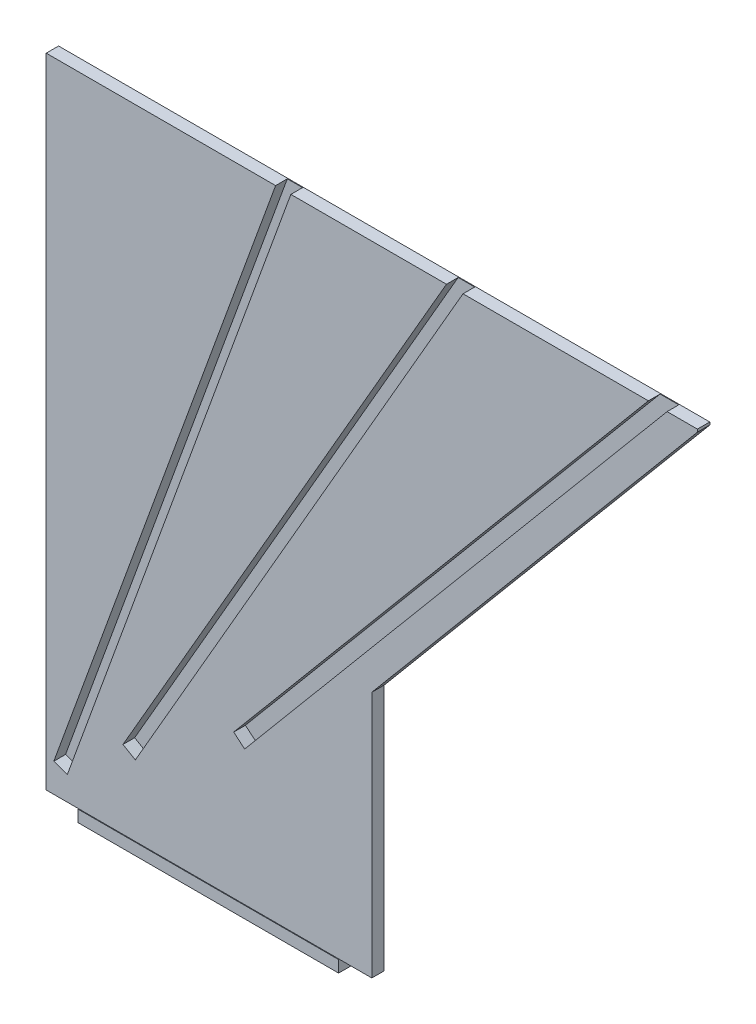
ISO-10303-21;
HEADER;
FILE_DESCRIPTION(('STEP AP214'),'2;1');
FILE_NAME('part.step','',(''),(''),'','','');
FILE_SCHEMA(('AUTOMOTIVE_DESIGN { 1 0 10303 214 1 1 1 1 }'));
ENDSEC;
DATA;
#1=APPLICATION_CONTEXT('core data for automotive mechanical design processes');
#2=APPLICATION_PROTOCOL_DEFINITION('international standard','automotive_design',2000,#1);
#3=PRODUCT_CONTEXT('',#1,'mechanical');
#4=PRODUCT('Part','Part','',(#3));
#5=PRODUCT_RELATED_PRODUCT_CATEGORY('part','',(#4));
#6=PRODUCT_DEFINITION_FORMATION('','',#4);
#7=PRODUCT_DEFINITION_CONTEXT('part definition',#1,'design');
#8=PRODUCT_DEFINITION('design','',#6,#7);
#9=PRODUCT_DEFINITION_SHAPE('','',#8);
#10=(LENGTH_UNIT() NAMED_UNIT(*) SI_UNIT(.MILLI.,.METRE.));
#11=(NAMED_UNIT(*) PLANE_ANGLE_UNIT() SI_UNIT($,.RADIAN.));
#12=(NAMED_UNIT(*) SI_UNIT($,.STERADIAN.) SOLID_ANGLE_UNIT());
#13=UNCERTAINTY_MEASURE_WITH_UNIT(LENGTH_MEASURE(1.E-05),#10,'distance_accuracy_value','');
#14=(GEOMETRIC_REPRESENTATION_CONTEXT(3) GLOBAL_UNCERTAINTY_ASSIGNED_CONTEXT((#13)) GLOBAL_UNIT_ASSIGNED_CONTEXT((#10,
#11,#12)) REPRESENTATION_CONTEXT('',''));
#15=CARTESIAN_POINT('',(0.,0.,0.));
#16=DIRECTION('',(0.,0.,1.));
#17=DIRECTION('',(1.,0.,0.));
#18=AXIS2_PLACEMENT_3D('',#15,#16,#17);
#19=CARTESIAN_POINT('',(-27.0477589529464,9.84457916247911,1.9));
#20=DIRECTION('',(0.939692620785914,-0.342020143325652,0.));
#21=DIRECTION('',(0.342020143325652,0.939692620785915,0.));
#22=AXIS2_PLACEMENT_3D('',#19,#20,#21);
#23=PLANE('',#22);
#24=DIRECTION('',(-0.342020143325652,-0.939692620785914,0.));
#25=VECTOR('',#24,1.);
#26=CARTESIAN_POINT('',(-46.771329023081,-44.3454842362497,0.1));
#27=LINE('',#26,#25);
#28=CARTESIAN_POINT('',(-12.4323810236568,50.,0.1));
#29=VERTEX_POINT('',#28);
#30=CARTESIAN_POINT('',(-46.771329023081,-44.3454842362497,0.1));
#31=VERTEX_POINT('',#30);
#32=EDGE_CURVE('E229',#29,#31,#27,.T.);
#33=ORIENTED_EDGE('',*,*,#32,.T.);
#34=DIRECTION('',(0.,0.,-1.));
#35=VECTOR('',#34,1.);
#36=CARTESIAN_POINT('',(-46.771329023081,-44.3454842362497,1.9));
#37=LINE('',#36,#35);
#38=CARTESIAN_POINT('',(-46.771329023081,-44.3454842362497,1.9));
#39=VERTEX_POINT('',#38);
#40=EDGE_CURVE('E389',#39,#31,#37,.T.);
#41=ORIENTED_EDGE('',*,*,#40,.F.);
#42=DIRECTION('',(-0.342020143325652,-0.939692620785915,0.));
#43=VECTOR('',#42,1.);
#44=CARTESIAN_POINT('',(-27.0477589529464,9.84457916247911,1.9));
#45=LINE('',#44,#43);
#46=CARTESIAN_POINT('',(-12.4323810236568,50.,1.9));
#47=VERTEX_POINT('',#46);
#48=EDGE_CURVE('E334',#47,#39,#45,.T.);
#49=ORIENTED_EDGE('',*,*,#48,.F.);
#50=DIRECTION('',(0.,0.,-1.));
#51=VECTOR('',#50,1.);
#52=CARTESIAN_POINT('',(-12.4323810236568,50.,1.9));
#53=LINE('',#52,#51);
#54=EDGE_CURVE('E393',#47,#29,#53,.T.);
#55=ORIENTED_EDGE('',*,*,#54,.T.);
#56=EDGE_LOOP('',(#33,#41,#49,#55));
#57=FACE_BOUND('',#56,.T.);
#58=ADVANCED_FACE('F43',(#57),#23,.F.);
#59=CARTESIAN_POINT('',(-19.7235700701345,-54.1900633987288,1.9));
#60=DIRECTION('',(0.342020143325651,0.939692620785915,0.));
#61=DIRECTION('',(-0.939692620785915,0.342020143325651,0.));
#62=AXIS2_PLACEMENT_3D('',#59,#60,#61);
#63=PLANE('',#62);
#64=ORIENTED_EDGE('',*,*,#40,.T.);
#65=DIRECTION('',(-0.939692620785913,0.342020143325656,0.));
#66=VECTOR('',#65,1.);
#67=CARTESIAN_POINT('',(-48.8386527888107,-43.5930399209329,0.1));
#68=LINE('',#67,#66);
#69=CARTESIAN_POINT('',(-48.8386527888107,-43.5930399209329,0.1));
#70=VERTEX_POINT('',#69);
#71=EDGE_CURVE('E247',#31,#70,#68,.T.);
#72=ORIENTED_EDGE('',*,*,#71,.T.);
#73=DIRECTION('',(0.,0.,-1.));
#74=VECTOR('',#73,1.);
#75=CARTESIAN_POINT('',(-48.8386527888107,-43.5930399209329,1.9));
#76=LINE('',#75,#74);
#77=CARTESIAN_POINT('',(-48.8386527888107,-43.5930399209329,1.9));
#78=VERTEX_POINT('',#77);
#79=EDGE_CURVE('E385',#78,#70,#76,.T.);
#80=ORIENTED_EDGE('',*,*,#79,.F.);
#81=DIRECTION('',(0.939692620785915,-0.342020143325651,0.));
#82=VECTOR('',#81,1.);
#83=CARTESIAN_POINT('',(-19.7235700701345,-54.1900633987288,1.9));
#84=LINE('',#83,#82);
#85=EDGE_CURVE('E337',#78,#39,#84,.T.);
#86=ORIENTED_EDGE('',*,*,#85,.T.);
#87=EDGE_LOOP('',(#64,#72,#80,#86));
#88=FACE_BOUND('',#87,.T.);
#89=ADVANCED_FACE('F517',(#88),#63,.T.);
#90=CARTESIAN_POINT('',(-29.1150827186754,10.5970234777959,1.9));
#91=DIRECTION('',(0.939692620785911,-0.342020143325662,0.));
#92=DIRECTION('',(0.342020143325662,0.939692620785911,0.));
#93=AXIS2_PLACEMENT_3D('',#90,#91,#92);
#94=PLANE('',#93);
#95=ORIENTED_EDGE('',*,*,#79,.T.);
#96=DIRECTION('',(0.342020143325662,0.939692620785911,0.));
#97=VECTOR('',#96,1.);
#98=CARTESIAN_POINT('',(-14.7735721231035,50.,0.1));
#99=LINE('',#98,#97);
#100=CARTESIAN_POINT('',(-14.7735721231035,50.,0.1));
#101=VERTEX_POINT('',#100);
#102=EDGE_CURVE('E251',#70,#101,#99,.T.);
#103=ORIENTED_EDGE('',*,*,#102,.T.);
#104=DIRECTION('',(0.,0.,-1.));
#105=VECTOR('',#104,1.);
#106=CARTESIAN_POINT('',(-14.7735721231035,50.,1.9));
#107=LINE('',#106,#105);
#108=CARTESIAN_POINT('',(-14.7735721231035,50.,1.9));
#109=VERTEX_POINT('',#108);
#110=EDGE_CURVE('E381',#109,#101,#107,.T.);
#111=ORIENTED_EDGE('',*,*,#110,.F.);
#112=DIRECTION('',(-0.342020143325662,-0.939692620785911,0.));
#113=VECTOR('',#112,1.);
#114=CARTESIAN_POINT('',(-29.1150827186754,10.5970234777959,1.9));
#115=LINE('',#114,#113);
#116=EDGE_CURVE('E341',#109,#78,#115,.T.);
#117=ORIENTED_EDGE('',*,*,#116,.T.);
#118=EDGE_LOOP('',(#95,#103,#111,#117));
#119=FACE_BOUND('',#118,.T.);
#120=ADVANCED_FACE('F523',(#119),#94,.T.);
#121=CARTESIAN_POINT('',(-11.146736961228,6.43557158515087,1.9));
#122=DIRECTION('',(0.86602540378444,-0.499999999999998,0.));
#123=DIRECTION('',(0.499999999999998,0.86602540378444,0.));
#124=AXIS2_PLACEMENT_3D('',#121,#122,#123);
#125=PLANE('',#124);
#126=DIRECTION('',(-0.499999999999998,-0.86602540378444,0.));
#127=VECTOR('',#126,1.);
#128=CARTESIAN_POINT('',(14.0051975111772,50.,0.1));
#129=LINE('',#128,#127);
#130=CARTESIAN_POINT('',(14.0051975111772,50.,0.1));
#131=VERTEX_POINT('',#130);
#132=CARTESIAN_POINT('',(-36.3123451368763,-37.1525403784431,0.1));
#133=VERTEX_POINT('',#132);
#134=EDGE_CURVE('E263',#131,#133,#129,.T.);
#135=ORIENTED_EDGE('',*,*,#134,.T.);
#136=DIRECTION('',(0.,0.,-1.));
#137=VECTOR('',#136,1.);
#138=CARTESIAN_POINT('',(-36.3123451368763,-37.1525403784431,1.9));
#139=LINE('',#138,#137);
#140=CARTESIAN_POINT('',(-36.3123451368763,-37.1525403784431,1.9));
#141=VERTEX_POINT('',#140);
#142=EDGE_CURVE('E405',#141,#133,#139,.T.);
#143=ORIENTED_EDGE('',*,*,#142,.F.);
#144=DIRECTION('',(-0.499999999999998,-0.86602540378444,0.));
#145=VECTOR('',#144,1.);
#146=CARTESIAN_POINT('',(-11.146736961228,6.43557158515087,1.9));
#147=LINE('',#146,#145);
#148=CARTESIAN_POINT('',(14.0051975111772,50.,1.9));
#149=VERTEX_POINT('',#148);
#150=EDGE_CURVE('E322',#149,#141,#147,.T.);
#151=ORIENTED_EDGE('',*,*,#150,.F.);
#152=DIRECTION('',(0.,0.,-1.));
#153=VECTOR('',#152,1.);
#154=CARTESIAN_POINT('',(14.0051975111772,50.,1.9));
#155=LINE('',#154,#153);
#156=EDGE_CURVE('E409',#149,#131,#155,.T.);
#157=ORIENTED_EDGE('',*,*,#156,.T.);
#158=EDGE_LOOP('',(#135,#143,#151,#157));
#159=FACE_BOUND('',#158,.T.);
#160=ADVANCED_FACE('F536',(#159),#125,.F.);
#161=CARTESIAN_POINT('',(-25.1656081756484,-43.5881119635939,1.9));
#162=DIRECTION('',(0.499999999999998,0.866025403784439,0.));
#163=DIRECTION('',(-0.86602540378444,0.499999999999998,0.));
#164=AXIS2_PLACEMENT_3D('',#161,#162,#163);
#165=PLANE('',#164);
#166=ORIENTED_EDGE('',*,*,#142,.T.);
#167=DIRECTION('',(-0.866025403784437,0.500000000000002,0.));
#168=VECTOR('',#167,1.);
#169=CARTESIAN_POINT('',(-36.3123451368763,-37.1525403784431,0.1));
#170=LINE('',#169,#168);
#171=CARTESIAN_POINT('',(-38.2176010252015,-36.0525403784434,0.1));
#172=VERTEX_POINT('',#171);
#173=EDGE_CURVE('E266',#133,#172,#170,.T.);
#174=ORIENTED_EDGE('',*,*,#173,.T.);
#175=DIRECTION('',(0.,0.,-1.));
#176=VECTOR('',#175,1.);
#177=CARTESIAN_POINT('',(-38.2176010252015,-36.0525403784434,1.9));
#178=LINE('',#177,#176);
#179=CARTESIAN_POINT('',(-38.2176010252015,-36.0525403784434,1.9));
#180=VERTEX_POINT('',#179);
#181=EDGE_CURVE('E401',#180,#172,#178,.T.);
#182=ORIENTED_EDGE('',*,*,#181,.F.);
#183=DIRECTION('',(0.86602540378444,-0.499999999999998,0.));
#184=VECTOR('',#183,1.);
#185=CARTESIAN_POINT('',(-25.1656081756484,-43.5881119635939,1.9));
#186=LINE('',#185,#184);
#187=EDGE_CURVE('E325',#180,#141,#186,.T.);
#188=ORIENTED_EDGE('',*,*,#187,.T.);
#189=EDGE_LOOP('',(#166,#174,#182,#188));
#190=FACE_BOUND('',#189,.T.);
#191=ADVANCED_FACE('F532',(#190),#165,.T.);
#192=CARTESIAN_POINT('',(-13.0519928495532,7.53557158515055,1.9));
#193=DIRECTION('',(0.86602540378444,-0.499999999999997,0.));
#194=DIRECTION('',(0.499999999999997,0.86602540378444,0.));
#195=AXIS2_PLACEMENT_3D('',#192,#193,#194);
#196=PLANE('',#195);
#197=ORIENTED_EDGE('',*,*,#181,.T.);
#198=DIRECTION('',(0.499999999999997,0.86602540378444,0.));
#199=VECTOR('',#198,1.);
#200=CARTESIAN_POINT('',(-38.2176010252015,-36.0525403784434,0.1));
#201=LINE('',#200,#199);
#202=CARTESIAN_POINT('',(11.4648563267435,50.,0.1));
#203=VERTEX_POINT('',#202);
#204=EDGE_CURVE('E269',#172,#203,#201,.T.);
#205=ORIENTED_EDGE('',*,*,#204,.T.);
#206=DIRECTION('',(0.,0.,-1.));
#207=VECTOR('',#206,1.);
#208=CARTESIAN_POINT('',(11.4648563267435,50.,1.9));
#209=LINE('',#208,#207);
#210=CARTESIAN_POINT('',(11.4648563267435,50.,1.9));
#211=VERTEX_POINT('',#210);
#212=EDGE_CURVE('E397',#211,#203,#209,.T.);
#213=ORIENTED_EDGE('',*,*,#212,.F.);
#214=DIRECTION('',(-0.499999999999997,-0.86602540378444,0.));
#215=VECTOR('',#214,1.);
#216=CARTESIAN_POINT('',(-13.0519928495532,7.53557158515055,1.9));
#217=LINE('',#216,#215);
#218=EDGE_CURVE('E329',#211,#180,#217,.T.);
#219=ORIENTED_EDGE('',*,*,#218,.T.);
#220=EDGE_LOOP('',(#197,#205,#213,#219));
#221=FACE_BOUND('',#220,.T.);
#222=ADVANCED_FACE('F528',(#221),#196,.T.);
#223=CARTESIAN_POINT('',(1.98987915939745,-1.66970686873775,1.9));
#224=DIRECTION('',(0.76604444311898,-0.642787609686537,0.));
#225=DIRECTION('',(0.642787609686537,0.76604444311898,0.));
#226=AXIS2_PLACEMENT_3D('',#223,#224,#225);
#227=PLANE('',#226);
#228=DIRECTION('',(-0.642787609686537,-0.766044443118979,0.));
#229=VECTOR('',#228,1.);
#230=CARTESIAN_POINT('',(-19.5261489634952,-27.3115106825532,0.1));
#231=LINE('',#230,#229);
#232=CARTESIAN_POINT('',(45.3459111359932,50.,0.1));
#233=VERTEX_POINT('',#232);
#234=CARTESIAN_POINT('',(-19.5261489634952,-27.3115106825532,0.1));
#235=VERTEX_POINT('',#234);
#236=EDGE_CURVE('E272',#233,#235,#231,.T.);
#237=ORIENTED_EDGE('',*,*,#236,.T.);
#238=DIRECTION('',(0.,0.,-1.));
#239=VECTOR('',#238,1.);
#240=CARTESIAN_POINT('',(-19.5261489634952,-27.3115106825532,1.9));
#241=LINE('',#240,#239);
#242=CARTESIAN_POINT('',(-19.5261489634952,-27.3115106825532,1.9));
#243=VERTEX_POINT('',#242);
#244=EDGE_CURVE('E420',#243,#235,#241,.T.);
#245=ORIENTED_EDGE('',*,*,#244,.F.);
#246=DIRECTION('',(-0.642787609686537,-0.76604444311898,0.));
#247=VECTOR('',#246,1.);
#248=CARTESIAN_POINT('',(1.98987915939745,-1.66970686873775,1.9));
#249=LINE('',#248,#247);
#250=CARTESIAN_POINT('',(45.3459111359932,50.,1.9));
#251=VERTEX_POINT('',#250);
#252=EDGE_CURVE('E309',#251,#243,#249,.T.);
#253=ORIENTED_EDGE('',*,*,#252,.F.);
#254=DIRECTION('',(0.,0.,-1.));
#255=VECTOR('',#254,1.);
#256=CARTESIAN_POINT('',(45.3459111359932,50.,1.9));
#257=LINE('',#256,#255);
#258=EDGE_CURVE('E424',#251,#233,#257,.T.);
#259=ORIENTED_EDGE('',*,*,#258,.T.);
#260=EDGE_LOOP('',(#237,#245,#253,#259));
#261=FACE_BOUND('',#260,.T.);
#262=ADVANCED_FACE('F531',(#261),#227,.F.);
#263=CARTESIAN_POINT('',(-21.5160281228926,-25.6418038138154,1.9));
#264=DIRECTION('',(0.642787609686537,0.76604444311898,0.));
#265=DIRECTION('',(-0.76604444311898,0.642787609686537,0.));
#266=AXIS2_PLACEMENT_3D('',#263,#264,#265);
#267=PLANE('',#266);
#268=ORIENTED_EDGE('',*,*,#244,.T.);
#269=DIRECTION('',(-0.766044443118977,0.64278760968654,0.));
#270=VECTOR('',#269,1.);
#271=CARTESIAN_POINT('',(-21.2114467383573,-25.8973779412424,0.1));
#272=LINE('',#271,#270);
#273=CARTESIAN_POINT('',(-21.2114467383573,-25.8973779412424,0.1));
#274=VERTEX_POINT('',#273);
#275=EDGE_CURVE('E276',#235,#274,#272,.T.);
#276=ORIENTED_EDGE('',*,*,#275,.T.);
#277=DIRECTION('',(0.,0.,-1.));
#278=VECTOR('',#277,1.);
#279=CARTESIAN_POINT('',(-21.2114467383573,-25.8973779412424,1.9));
#280=LINE('',#279,#278);
#281=CARTESIAN_POINT('',(-21.2114467383573,-25.8973779412424,1.9));
#282=VERTEX_POINT('',#281);
#283=EDGE_CURVE('E416',#282,#274,#280,.T.);
#284=ORIENTED_EDGE('',*,*,#283,.F.);
#285=DIRECTION('',(0.76604444311898,-0.642787609686537,0.));
#286=VECTOR('',#285,1.);
#287=CARTESIAN_POINT('',(-21.5160281228926,-25.6418038138154,1.9));
#288=LINE('',#287,#286);
#289=EDGE_CURVE('E314',#282,#243,#288,.T.);
#290=ORIENTED_EDGE('',*,*,#289,.T.);
#291=EDGE_LOOP('',(#268,#276,#284,#290));
#292=FACE_BOUND('',#291,.T.);
#293=ADVANCED_FACE('F544',(#292),#267,.T.);
#294=CARTESIAN_POINT('',(0.304581384535392,-0.255574127427114,1.9));
#295=DIRECTION('',(0.766044443118976,-0.642787609686542,0.));
#296=DIRECTION('',(0.642787609686542,0.766044443118976,0.));
#297=AXIS2_PLACEMENT_3D('',#294,#295,#296);
#298=PLANE('',#297);
#299=ORIENTED_EDGE('',*,*,#283,.T.);
#300=DIRECTION('',(0.642787609686542,0.766044443118976,0.));
#301=VECTOR('',#300,1.);
#302=CARTESIAN_POINT('',(42.4740150994622,50.,0.1));
#303=LINE('',#302,#301);
#304=CARTESIAN_POINT('',(42.4740150994622,50.,0.1));
#305=VERTEX_POINT('',#304);
#306=EDGE_CURVE('E280',#274,#305,#303,.T.);
#307=ORIENTED_EDGE('',*,*,#306,.T.);
#308=DIRECTION('',(0.,0.,-1.));
#309=VECTOR('',#308,1.);
#310=CARTESIAN_POINT('',(42.4740150994622,50.,1.9));
#311=LINE('',#310,#309);
#312=CARTESIAN_POINT('',(42.4740150994622,50.,1.9));
#313=VERTEX_POINT('',#312);
#314=EDGE_CURVE('E412',#313,#305,#311,.T.);
#315=ORIENTED_EDGE('',*,*,#314,.F.);
#316=DIRECTION('',(-0.642787609686542,-0.766044443118976,0.));
#317=VECTOR('',#316,1.);
#318=CARTESIAN_POINT('',(0.304581384535392,-0.255574127427114,1.9));
#319=LINE('',#318,#317);
#320=EDGE_CURVE('E318',#313,#282,#319,.T.);
#321=ORIENTED_EDGE('',*,*,#320,.T.);
#322=EDGE_LOOP('',(#299,#307,#315,#321));
#323=FACE_BOUND('',#322,.T.);
#324=ADVANCED_FACE('F541',(#323),#298,.T.);
#325=CARTESIAN_POINT('',(0.,-48.,1.9));
#326=DIRECTION('',(0.,1.,0.));
#327=DIRECTION('',(0.,0.,1.));
#328=AXIS2_PLACEMENT_3D('',#325,#326,#327);
#329=PLANE('',#328);
#330=DIRECTION('',(1.,0.,0.));
#331=VECTOR('',#330,1.);
#332=CARTESIAN_POINT('',(0.,-48.,0.));
#333=LINE('',#332,#331);
#334=CARTESIAN_POINT('',(-50.,-48.,0.));
#335=VERTEX_POINT('',#334);
#336=CARTESIAN_POINT('',(-45.,-48.,0.));
#337=VERTEX_POINT('',#336);
#338=EDGE_CURVE('E288',#335,#337,#333,.T.);
#339=ORIENTED_EDGE('',*,*,#338,.T.);
#340=DIRECTION('',(0.,0.,-1.));
#341=VECTOR('',#340,1.);
#342=CARTESIAN_POINT('',(-45.,-48.,1.9));
#343=LINE('',#342,#341);
#344=CARTESIAN_POINT('',(-45.,-48.,1.9));
#345=VERTEX_POINT('',#344);
#346=EDGE_CURVE('E445',#345,#337,#343,.T.);
#347=ORIENTED_EDGE('',*,*,#346,.F.);
#348=DIRECTION('',(1.,0.,0.));
#349=VECTOR('',#348,1.);
#350=CARTESIAN_POINT('',(0.,-48.,1.9));
#351=LINE('',#350,#349);
#352=CARTESIAN_POINT('',(-50.,-48.,1.9));
#353=VERTEX_POINT('',#352);
#354=EDGE_CURVE('E289',#353,#345,#351,.T.);
#355=ORIENTED_EDGE('',*,*,#354,.F.);
#356=DIRECTION('',(0.,0.,-1.));
#357=VECTOR('',#356,1.);
#358=CARTESIAN_POINT('',(-50.,-48.,1.9));
#359=LINE('',#358,#357);
#360=EDGE_CURVE('E348',#353,#335,#359,.T.);
#361=ORIENTED_EDGE('',*,*,#360,.T.);
#362=EDGE_LOOP('',(#339,#347,#355,#361));
#363=FACE_BOUND('',#362,.T.);
#364=ADVANCED_FACE('F514',(#363),#329,.F.);
#365=CARTESIAN_POINT('',(-45.,0.,1.9));
#366=DIRECTION('',(-1.,0.,0.));
#367=DIRECTION('',(0.,0.,1.));
#368=AXIS2_PLACEMENT_3D('',#365,#366,#367);
#369=PLANE('',#368);
#370=DIRECTION('',(0.,1.,0.));
#371=VECTOR('',#370,1.);
#372=CARTESIAN_POINT('',(-45.,0.,0.));
#373=LINE('',#372,#371);
#374=CARTESIAN_POINT('',(-45.,-49.8,0.));
#375=VERTEX_POINT('',#374);
#376=EDGE_CURVE('E352',#375,#337,#373,.T.);
#377=ORIENTED_EDGE('',*,*,#376,.F.);
#378=DIRECTION('',(0.,0.,1.));
#379=VECTOR('',#378,1.);
#380=CARTESIAN_POINT('',(-45.,-49.8,2.));
#381=LINE('',#380,#379);
#382=CARTESIAN_POINT('',(-45.,-49.8,2.));
#383=VERTEX_POINT('',#382);
#384=EDGE_CURVE('E462',#375,#383,#381,.T.);
#385=ORIENTED_EDGE('',*,*,#384,.T.);
#386=DIRECTION('',(0.,-1.,0.));
#387=VECTOR('',#386,1.);
#388=CARTESIAN_POINT('',(-45.,-50.,2.));
#389=LINE('',#388,#387);
#390=CARTESIAN_POINT('',(-45.,-48.,2.));
#391=VERTEX_POINT('',#390);
#392=EDGE_CURVE('E218',#391,#383,#389,.T.);
#393=ORIENTED_EDGE('',*,*,#392,.F.);
#394=DIRECTION('',(0.,0.,-1.));
#395=VECTOR('',#394,1.);
#396=CARTESIAN_POINT('',(-45.,-48.,2.));
#397=LINE('',#396,#395);
#398=EDGE_CURVE('E230',#391,#345,#397,.T.);
#399=ORIENTED_EDGE('',*,*,#398,.T.);
#400=ORIENTED_EDGE('',*,*,#346,.T.);
#401=EDGE_LOOP('',(#377,#385,#393,#399,#400));
#402=FACE_BOUND('',#401,.T.);
#403=ADVANCED_FACE('F500',(#402),#369,.T.);
#404=CARTESIAN_POINT('',(0.,-50.,1.9));
#405=DIRECTION('',(0.,1.,0.));
#406=DIRECTION('',(-1.,0.,0.));
#407=AXIS2_PLACEMENT_3D('',#404,#405,#406);
#408=PLANE('',#407);
#409=DIRECTION('',(-1.,0.,0.));
#410=VECTOR('',#409,1.);
#411=CARTESIAN_POINT('',(0.,-50.,1.80000000000001));
#412=LINE('',#411,#410);
#413=CARTESIAN_POINT('',(-5.19999999999999,-50.,1.80000000000001));
#414=VERTEX_POINT('',#413);
#415=CARTESIAN_POINT('',(-44.8,-50.,1.80000000000001));
#416=VERTEX_POINT('',#415);
#417=EDGE_CURVE('E455',#414,#416,#412,.T.);
#418=ORIENTED_EDGE('',*,*,#417,.T.);
#419=DIRECTION('',(0.,0.,-1.));
#420=VECTOR('',#419,1.);
#421=CARTESIAN_POINT('',(-44.8,-50.,0.));
#422=LINE('',#421,#420);
#423=CARTESIAN_POINT('',(-44.8,-50.,0.199999999999992));
#424=VERTEX_POINT('',#423);
#425=EDGE_CURVE('E458',#416,#424,#422,.T.);
#426=ORIENTED_EDGE('',*,*,#425,.T.);
#427=DIRECTION('',(1.,0.,0.));
#428=VECTOR('',#427,1.);
#429=CARTESIAN_POINT('',(0.,-50.,0.199999999999992));
#430=LINE('',#429,#428);
#431=CARTESIAN_POINT('',(-5.19999999999999,-50.,0.199999999999992));
#432=VERTEX_POINT('',#431);
#433=EDGE_CURVE('E449',#424,#432,#430,.T.);
#434=ORIENTED_EDGE('',*,*,#433,.T.);
#435=DIRECTION('',(0.,0.,1.));
#436=VECTOR('',#435,1.);
#437=CARTESIAN_POINT('',(-5.19999999999999,-50.,2.));
#438=LINE('',#437,#436);
#439=EDGE_CURVE('E452',#432,#414,#438,.T.);
#440=ORIENTED_EDGE('',*,*,#439,.T.);
#441=EDGE_LOOP('',(#418,#426,#434,#440));
#442=FACE_BOUND('',#441,.T.);
#443=ADVANCED_FACE('F505',(#442),#408,.F.);
#444=CARTESIAN_POINT('',(-5.,0.,1.9));
#445=DIRECTION('',(1.,0.,0.));
#446=DIRECTION('',(0.,0.,-1.));
#447=AXIS2_PLACEMENT_3D('',#444,#445,#446);
#448=PLANE('',#447);
#449=DIRECTION('',(0.,1.,0.));
#450=VECTOR('',#449,1.);
#451=CARTESIAN_POINT('',(-5.,-48.,2.));
#452=LINE('',#451,#450);
#453=CARTESIAN_POINT('',(-5.,-49.8,2.));
#454=VERTEX_POINT('',#453);
#455=CARTESIAN_POINT('',(-5.,-48.,2.));
#456=VERTEX_POINT('',#455);
#457=EDGE_CURVE('E211',#454,#456,#452,.T.);
#458=ORIENTED_EDGE('',*,*,#457,.F.);
#459=DIRECTION('',(0.,0.,-1.));
#460=VECTOR('',#459,1.);
#461=CARTESIAN_POINT('',(-5.,-49.8,0.));
#462=LINE('',#461,#460);
#463=CARTESIAN_POINT('',(-5.,-49.8,0.));
#464=VERTEX_POINT('',#463);
#465=EDGE_CURVE('E54',#454,#464,#462,.T.);
#466=ORIENTED_EDGE('',*,*,#465,.T.);
#467=DIRECTION('',(0.,-1.,0.));
#468=VECTOR('',#467,1.);
#469=CARTESIAN_POINT('',(-5.,0.,0.));
#470=LINE('',#469,#468);
#471=CARTESIAN_POINT('',(-5.,-48.,0.));
#472=VERTEX_POINT('',#471);
#473=EDGE_CURVE('E356',#472,#464,#470,.T.);
#474=ORIENTED_EDGE('',*,*,#473,.F.);
#475=DIRECTION('',(0.,0.,-1.));
#476=VECTOR('',#475,1.);
#477=CARTESIAN_POINT('',(-5.,-48.,1.9));
#478=LINE('',#477,#476);
#479=CARTESIAN_POINT('',(-5.,-48.,1.9));
#480=VERTEX_POINT('',#479);
#481=EDGE_CURVE('E224',#480,#472,#478,.T.);
#482=ORIENTED_EDGE('',*,*,#481,.F.);
#483=DIRECTION('',(0.,0.,-1.));
#484=VECTOR('',#483,1.);
#485=CARTESIAN_POINT('',(-5.,-48.,2.));
#486=LINE('',#485,#484);
#487=EDGE_CURVE('E222',#456,#480,#486,.T.);
#488=ORIENTED_EDGE('',*,*,#487,.F.);
#489=EDGE_LOOP('',(#458,#466,#474,#482,#488));
#490=FACE_BOUND('',#489,.T.);
#491=ADVANCED_FACE('F223',(#490),#448,.T.);
#492=CARTESIAN_POINT('',(0.,-48.,0.));
#493=VERTEX_POINT('',#492);
#494=EDGE_CURVE('E353',#472,#493,#333,.T.);
#495=ORIENTED_EDGE('',*,*,#494,.T.);
#496=DIRECTION('',(0.,0.,-1.));
#497=VECTOR('',#496,1.);
#498=CARTESIAN_POINT('',(0.,-48.,1.9));
#499=LINE('',#498,#497);
#500=CARTESIAN_POINT('',(0.,-48.,1.9));
#501=VERTEX_POINT('',#500);
#502=EDGE_CURVE('E439',#501,#493,#499,.T.);
#503=ORIENTED_EDGE('',*,*,#502,.F.);
#504=EDGE_CURVE('E293',#480,#501,#351,.T.);
#505=ORIENTED_EDGE('',*,*,#504,.F.);
#506=ORIENTED_EDGE('',*,*,#481,.T.);
#507=EDGE_LOOP('',(#495,#503,#505,#506));
#508=FACE_BOUND('',#507,.T.);
#509=ADVANCED_FACE('F512',(#508),#329,.F.);
#510=CARTESIAN_POINT('',(0.,0.,1.9));
#511=DIRECTION('',(-1.,0.,0.));
#512=DIRECTION('',(0.,0.,1.));
#513=AXIS2_PLACEMENT_3D('',#510,#511,#512);
#514=PLANE('',#513);
#515=DIRECTION('',(0.,1.,0.));
#516=VECTOR('',#515,1.);
#517=CARTESIAN_POINT('',(0.,0.,0.));
#518=LINE('',#517,#516);
#519=CARTESIAN_POINT('',(0.,-10.,0.));
#520=VERTEX_POINT('',#519);
#521=EDGE_CURVE('E359',#493,#520,#518,.T.);
#522=ORIENTED_EDGE('',*,*,#521,.T.);
#523=DIRECTION('',(0.,0.,-1.));
#524=VECTOR('',#523,1.);
#525=CARTESIAN_POINT('',(0.,-10.,1.9));
#526=LINE('',#525,#524);
#527=CARTESIAN_POINT('',(0.,-10.,1.9));
#528=VERTEX_POINT('',#527);
#529=EDGE_CURVE('E435',#528,#520,#526,.T.);
#530=ORIENTED_EDGE('',*,*,#529,.F.);
#531=DIRECTION('',(0.,1.,0.));
#532=VECTOR('',#531,1.);
#533=CARTESIAN_POINT('',(0.,0.,1.9));
#534=LINE('',#533,#532);
#535=EDGE_CURVE('E295',#501,#528,#534,.T.);
#536=ORIENTED_EDGE('',*,*,#535,.F.);
#537=ORIENTED_EDGE('',*,*,#502,.T.);
#538=EDGE_LOOP('',(#522,#530,#536,#537));
#539=FACE_BOUND('',#538,.T.);
#540=ADVANCED_FACE('F560',(#539),#514,.F.);
#541=CARTESIAN_POINT('',(4.92403876506104,-4.13175911166533,1.9));
#542=DIRECTION('',(-0.766044443118979,0.642787609686538,0.));
#543=DIRECTION('',(-0.642787609686538,-0.766044443118979,0.));
#544=AXIS2_PLACEMENT_3D('',#541,#542,#543);
#545=PLANE('',#544);
#546=DIRECTION('',(0.642787609686538,0.766044443118979,0.));
#547=VECTOR('',#546,1.);
#548=CARTESIAN_POINT('',(4.92403876506104,-4.13175911166533,0.));
#549=LINE('',#548,#547);
#550=CARTESIAN_POINT('',(50.,49.5876796297107,0.));
#551=VERTEX_POINT('',#550);
#552=EDGE_CURVE('E362',#520,#551,#549,.T.);
#553=ORIENTED_EDGE('',*,*,#552,.T.);
#554=DIRECTION('',(0.,0.,-1.));
#555=VECTOR('',#554,1.);
#556=CARTESIAN_POINT('',(50.,49.5876796297107,1.9));
#557=LINE('',#556,#555);
#558=CARTESIAN_POINT('',(50.,49.5876796297107,1.9));
#559=VERTEX_POINT('',#558);
#560=EDGE_CURVE('E432',#559,#551,#557,.T.);
#561=ORIENTED_EDGE('',*,*,#560,.F.);
#562=DIRECTION('',(0.642787609686538,0.766044443118979,0.));
#563=VECTOR('',#562,1.);
#564=CARTESIAN_POINT('',(4.92403876506104,-4.13175911166533,1.9));
#565=LINE('',#564,#563);
#566=EDGE_CURVE('E298',#528,#559,#565,.T.);
#567=ORIENTED_EDGE('',*,*,#566,.F.);
#568=ORIENTED_EDGE('',*,*,#529,.T.);
#569=EDGE_LOOP('',(#553,#561,#567,#568));
#570=FACE_BOUND('',#569,.T.);
#571=ADVANCED_FACE('F556',(#570),#545,.F.);
#572=CARTESIAN_POINT('',(50.,0.,1.9));
#573=DIRECTION('',(1.,0.,0.));
#574=DIRECTION('',(0.,1.,0.));
#575=AXIS2_PLACEMENT_3D('',#572,#573,#574);
#576=PLANE('',#575);
#577=DIRECTION('',(0.,-1.,0.));
#578=VECTOR('',#577,1.);
#579=CARTESIAN_POINT('',(50.,0.,0.));
#580=LINE('',#579,#578);
#581=CARTESIAN_POINT('',(50.,50.,0.));
#582=VERTEX_POINT('',#581);
#583=EDGE_CURVE('E366',#582,#551,#580,.T.);
#584=ORIENTED_EDGE('',*,*,#583,.F.);
#585=DIRECTION('',(0.,0.,-1.));
#586=VECTOR('',#585,1.);
#587=CARTESIAN_POINT('',(50.,50.,1.9));
#588=LINE('',#587,#586);
#589=CARTESIAN_POINT('',(50.,50.,1.9));
#590=VERTEX_POINT('',#589);
#591=EDGE_CURVE('E428',#590,#582,#588,.T.);
#592=ORIENTED_EDGE('',*,*,#591,.F.);
#593=DIRECTION('',(0.,-1.,0.));
#594=VECTOR('',#593,1.);
#595=CARTESIAN_POINT('',(50.,0.,1.9));
#596=LINE('',#595,#594);
#597=EDGE_CURVE('E301',#590,#559,#596,.T.);
#598=ORIENTED_EDGE('',*,*,#597,.T.);
#599=ORIENTED_EDGE('',*,*,#560,.T.);
#600=EDGE_LOOP('',(#584,#592,#598,#599));
#601=FACE_BOUND('',#600,.T.);
#602=ADVANCED_FACE('F552',(#601),#576,.T.);
#603=CARTESIAN_POINT('',(0.,50.,1.9));
#604=DIRECTION('',(0.,1.,0.));
#605=DIRECTION('',(0.,0.,1.));
#606=AXIS2_PLACEMENT_3D('',#603,#604,#605);
#607=PLANE('',#606);
#608=DIRECTION('',(1.,0.,0.));
#609=VECTOR('',#608,1.);
#610=CARTESIAN_POINT('',(0.,50.,0.));
#611=LINE('',#610,#609);
#612=CARTESIAN_POINT('',(-50.,50.,0.));
#613=VERTEX_POINT('',#612);
#614=EDGE_CURVE('E370',#613,#582,#611,.T.);
#615=ORIENTED_EDGE('',*,*,#614,.F.);
#616=DIRECTION('',(0.,0.,-1.));
#617=VECTOR('',#616,1.);
#618=CARTESIAN_POINT('',(-50.,50.,1.9));
#619=LINE('',#618,#617);
#620=CARTESIAN_POINT('',(-50.,50.,1.9));
#621=VERTEX_POINT('',#620);
#622=EDGE_CURVE('E378',#621,#613,#619,.T.);
#623=ORIENTED_EDGE('',*,*,#622,.F.);
#624=DIRECTION('',(1.,0.,0.));
#625=VECTOR('',#624,1.);
#626=CARTESIAN_POINT('',(0.,50.,1.9));
#627=LINE('',#626,#625);
#628=EDGE_CURVE('E310',#621,#109,#627,.T.);
#629=ORIENTED_EDGE('',*,*,#628,.T.);
#630=ORIENTED_EDGE('',*,*,#110,.T.);
#631=DIRECTION('',(1.,0.,0.));
#632=VECTOR('',#631,1.);
#633=CARTESIAN_POINT('',(-12.4323810236568,50.,0.1));
#634=LINE('',#633,#632);
#635=EDGE_CURVE('E255',#101,#29,#634,.T.);
#636=ORIENTED_EDGE('',*,*,#635,.T.);
#637=ORIENTED_EDGE('',*,*,#54,.F.);
#638=EDGE_CURVE('E333',#47,#211,#627,.T.);
#639=ORIENTED_EDGE('',*,*,#638,.T.);
#640=ORIENTED_EDGE('',*,*,#212,.T.);
#641=DIRECTION('',(1.,0.,0.));
#642=VECTOR('',#641,1.);
#643=CARTESIAN_POINT('',(11.4648563267435,50.,0.1));
#644=LINE('',#643,#642);
#645=EDGE_CURVE('E259',#203,#131,#644,.T.);
#646=ORIENTED_EDGE('',*,*,#645,.T.);
#647=ORIENTED_EDGE('',*,*,#156,.F.);
#648=EDGE_CURVE('E311',#149,#313,#627,.T.);
#649=ORIENTED_EDGE('',*,*,#648,.T.);
#650=ORIENTED_EDGE('',*,*,#314,.T.);
#651=DIRECTION('',(1.,0.,0.));
#652=VECTOR('',#651,1.);
#653=CARTESIAN_POINT('',(45.3459111359932,50.,0.1));
#654=LINE('',#653,#652);
#655=EDGE_CURVE('E284',#305,#233,#654,.T.);
#656=ORIENTED_EDGE('',*,*,#655,.T.);
#657=ORIENTED_EDGE('',*,*,#258,.F.);
#658=EDGE_CURVE('E305',#251,#590,#627,.T.);
#659=ORIENTED_EDGE('',*,*,#658,.T.);
#660=ORIENTED_EDGE('',*,*,#591,.T.);
#661=EDGE_LOOP('',(#615,#623,#629,#630,#636,#637,#639,#640,#646,#647,#649,#650,#656,#657,#659,#660));
#662=FACE_BOUND('',#661,.T.);
#663=ADVANCED_FACE('F555',(#662),#607,.T.);
#664=CARTESIAN_POINT('',(-50.,0.,1.9));
#665=DIRECTION('',(1.,0.,0.));
#666=DIRECTION('',(0.,1.,0.));
#667=AXIS2_PLACEMENT_3D('',#664,#665,#666);
#668=PLANE('',#667);
#669=DIRECTION('',(0.,-1.,0.));
#670=VECTOR('',#669,1.);
#671=CARTESIAN_POINT('',(-50.,0.,0.));
#672=LINE('',#671,#670);
#673=EDGE_CURVE('E294',#613,#335,#672,.T.);
#674=ORIENTED_EDGE('',*,*,#673,.T.);
#675=ORIENTED_EDGE('',*,*,#360,.F.);
#676=DIRECTION('',(0.,-1.,0.));
#677=VECTOR('',#676,1.);
#678=CARTESIAN_POINT('',(-50.,0.,1.9));
#679=LINE('',#678,#677);
#680=EDGE_CURVE('E345',#621,#353,#679,.T.);
#681=ORIENTED_EDGE('',*,*,#680,.F.);
#682=ORIENTED_EDGE('',*,*,#622,.T.);
#683=EDGE_LOOP('',(#674,#675,#681,#682));
#684=FACE_BOUND('',#683,.T.);
#685=ADVANCED_FACE('F638',(#684),#668,.F.);
#686=CARTESIAN_POINT('',(0.,0.,1.9));
#687=DIRECTION('',(0.,0.,1.));
#688=DIRECTION('',(1.,0.,0.));
#689=AXIS2_PLACEMENT_3D('',#686,#687,#688);
#690=PLANE('',#689);
#691=DIRECTION('',(-1.,0.,0.));
#692=VECTOR('',#691,1.);
#693=CARTESIAN_POINT('',(-45.,-48.,1.9));
#694=LINE('',#693,#692);
#695=EDGE_CURVE('E241',#480,#345,#694,.T.);
#696=ORIENTED_EDGE('',*,*,#695,.F.);
#697=ORIENTED_EDGE('',*,*,#504,.T.);
#698=ORIENTED_EDGE('',*,*,#535,.T.);
#699=ORIENTED_EDGE('',*,*,#566,.T.);
#700=ORIENTED_EDGE('',*,*,#597,.F.);
#701=ORIENTED_EDGE('',*,*,#658,.F.);
#702=ORIENTED_EDGE('',*,*,#252,.T.);
#703=ORIENTED_EDGE('',*,*,#289,.F.);
#704=ORIENTED_EDGE('',*,*,#320,.F.);
#705=ORIENTED_EDGE('',*,*,#648,.F.);
#706=ORIENTED_EDGE('',*,*,#150,.T.);
#707=ORIENTED_EDGE('',*,*,#187,.F.);
#708=ORIENTED_EDGE('',*,*,#218,.F.);
#709=ORIENTED_EDGE('',*,*,#638,.F.);
#710=ORIENTED_EDGE('',*,*,#48,.T.);
#711=ORIENTED_EDGE('',*,*,#85,.F.);
#712=ORIENTED_EDGE('',*,*,#116,.F.);
#713=ORIENTED_EDGE('',*,*,#628,.F.);
#714=ORIENTED_EDGE('',*,*,#680,.T.);
#715=ORIENTED_EDGE('',*,*,#354,.T.);
#716=EDGE_LOOP('',(#696,#697,#698,#699,#700,#701,#702,#703,#704,#705,#706,#707,#708,#709,#710,
#711,#712,#713,#714,#715));
#717=FACE_BOUND('',#716,.T.);
#718=ADVANCED_FACE('F601',(#717),#690,.T.);
#719=CARTESIAN_POINT('',(0.,0.,0.));
#720=DIRECTION('',(0.,0.,1.));
#721=DIRECTION('',(1.,0.,0.));
#722=AXIS2_PLACEMENT_3D('',#719,#720,#721);
#723=PLANE('',#722);
#724=ORIENTED_EDGE('',*,*,#473,.T.);
#725=DIRECTION('',(-1.,0.,0.));
#726=VECTOR('',#725,1.);
#727=CARTESIAN_POINT('',(0.,-49.8,0.));
#728=LINE('',#727,#726);
#729=EDGE_CURVE('E11',#464,#375,#728,.T.);
#730=ORIENTED_EDGE('',*,*,#729,.T.);
#731=ORIENTED_EDGE('',*,*,#376,.T.);
#732=ORIENTED_EDGE('',*,*,#338,.F.);
#733=ORIENTED_EDGE('',*,*,#673,.F.);
#734=ORIENTED_EDGE('',*,*,#614,.T.);
#735=ORIENTED_EDGE('',*,*,#583,.T.);
#736=ORIENTED_EDGE('',*,*,#552,.F.);
#737=ORIENTED_EDGE('',*,*,#521,.F.);
#738=ORIENTED_EDGE('',*,*,#494,.F.);
#739=EDGE_LOOP('',(#724,#730,#731,#732,#733,#734,#735,#736,#737,#738));
#740=FACE_BOUND('',#739,.T.);
#741=ADVANCED_FACE('F495',(#740),#723,.F.);
#742=CARTESIAN_POINT('',(0.,0.,0.1));
#743=DIRECTION('',(0.,0.,-1.));
#744=DIRECTION('',(-1.,0.,0.));
#745=AXIS2_PLACEMENT_3D('',#742,#743,#744);
#746=PLANE('',#745);
#747=ORIENTED_EDGE('',*,*,#236,.F.);
#748=ORIENTED_EDGE('',*,*,#655,.F.);
#749=ORIENTED_EDGE('',*,*,#306,.F.);
#750=ORIENTED_EDGE('',*,*,#275,.F.);
#751=EDGE_LOOP('',(#747,#748,#749,#750));
#752=FACE_BOUND('',#751,.T.);
#753=ADVANCED_FACE('F626',(#752),#746,.F.);
#754=CARTESIAN_POINT('',(0.,0.,0.1));
#755=DIRECTION('',(0.,0.,-1.));
#756=DIRECTION('',(-1.,0.,0.));
#757=AXIS2_PLACEMENT_3D('',#754,#755,#756);
#758=PLANE('',#757);
#759=ORIENTED_EDGE('',*,*,#645,.F.);
#760=ORIENTED_EDGE('',*,*,#204,.F.);
#761=ORIENTED_EDGE('',*,*,#173,.F.);
#762=ORIENTED_EDGE('',*,*,#134,.F.);
#763=EDGE_LOOP('',(#759,#760,#761,#762));
#764=FACE_BOUND('',#763,.T.);
#765=ADVANCED_FACE('F615',(#764),#758,.F.);
#766=CARTESIAN_POINT('',(0.,0.,0.1));
#767=DIRECTION('',(0.,0.,-1.));
#768=DIRECTION('',(-1.,0.,0.));
#769=AXIS2_PLACEMENT_3D('',#766,#767,#768);
#770=PLANE('',#769);
#771=ORIENTED_EDGE('',*,*,#32,.F.);
#772=ORIENTED_EDGE('',*,*,#635,.F.);
#773=ORIENTED_EDGE('',*,*,#102,.F.);
#774=ORIENTED_EDGE('',*,*,#71,.F.);
#775=EDGE_LOOP('',(#771,#772,#773,#774));
#776=FACE_BOUND('',#775,.T.);
#777=ADVANCED_FACE('F605',(#776),#770,.F.);
#778=CARTESIAN_POINT('',(-45.,-48.,2.));
#779=DIRECTION('',(0.,-1.,0.));
#780=DIRECTION('',(0.,0.,-1.));
#781=AXIS2_PLACEMENT_3D('',#778,#779,#780);
#782=PLANE('',#781);
#783=ORIENTED_EDGE('',*,*,#695,.T.);
#784=ORIENTED_EDGE('',*,*,#398,.F.);
#785=DIRECTION('',(-1.,0.,0.));
#786=VECTOR('',#785,1.);
#787=CARTESIAN_POINT('',(-45.,-48.,2.));
#788=LINE('',#787,#786);
#789=EDGE_CURVE('E215',#456,#391,#788,.T.);
#790=ORIENTED_EDGE('',*,*,#789,.F.);
#791=ORIENTED_EDGE('',*,*,#487,.T.);
#792=EDGE_LOOP('',(#783,#784,#790,#791));
#793=FACE_BOUND('',#792,.T.);
#794=ADVANCED_FACE('F232',(#793),#782,.F.);
#795=CARTESIAN_POINT('',(0.,0.,2.));
#796=DIRECTION('',(0.,0.,-1.));
#797=DIRECTION('',(-1.,0.,0.));
#798=AXIS2_PLACEMENT_3D('',#795,#796,#797);
#799=PLANE('',#798);
#800=ORIENTED_EDGE('',*,*,#392,.T.);
#801=DIRECTION('',(1.,0.,0.));
#802=VECTOR('',#801,1.);
#803=CARTESIAN_POINT('',(0.,-49.8,2.));
#804=LINE('',#803,#802);
#805=EDGE_CURVE('E69',#383,#454,#804,.T.);
#806=ORIENTED_EDGE('',*,*,#805,.T.);
#807=ORIENTED_EDGE('',*,*,#457,.T.);
#808=ORIENTED_EDGE('',*,*,#789,.T.);
#809=EDGE_LOOP('',(#800,#806,#807,#808));
#810=FACE_BOUND('',#809,.T.);
#811=ADVANCED_FACE('F213',(#810),#799,.F.);
#812=CARTESIAN_POINT('',(-5.,-49.8,1.9));
#813=DIRECTION('',(0.707106781186549,-0.707106781186546,0.));
#814=DIRECTION('',(0.,0.,1.));
#815=AXIS2_PLACEMENT_3D('',#812,#813,#814);
#816=PLANE('',#815);
#817=DIRECTION('',(0.577350269189617,0.57735026918962,-0.57735026918964));
#818=VECTOR('',#817,1.);
#819=CARTESIAN_POINT('',(-3.46666666666671,-48.2666666666667,-1.53333333333336));
#820=LINE('',#819,#818);
#821=EDGE_CURVE('E475',#464,#432,#820,.F.);
#822=ORIENTED_EDGE('',*,*,#821,.F.);
#823=ORIENTED_EDGE('',*,*,#465,.F.);
#824=DIRECTION('',(0.577350269189617,0.57735026918962,0.57735026918964));
#825=VECTOR('',#824,1.);
#826=CARTESIAN_POINT('',(-5.03333333333334,-49.8333333333334,1.96666666666667));
#827=LINE('',#826,#825);
#828=EDGE_CURVE('E48',#414,#454,#827,.T.);
#829=ORIENTED_EDGE('',*,*,#828,.F.);
#830=ORIENTED_EDGE('',*,*,#439,.F.);
#831=EDGE_LOOP('',(#822,#823,#829,#830));
#832=FACE_BOUND('',#831,.T.);
#833=ADVANCED_FACE('F46',(#832),#816,.T.);
#834=CARTESIAN_POINT('',(0.,-49.8,2.));
#835=DIRECTION('',(0.,0.70710678118656,-0.707106781186535));
#836=DIRECTION('',(1.,0.,0.));
#837=AXIS2_PLACEMENT_3D('',#834,#835,#836);
#838=PLANE('',#837);
#839=ORIENTED_EDGE('',*,*,#828,.T.);
#840=ORIENTED_EDGE('',*,*,#805,.F.);
#841=DIRECTION('',(-0.577350269189633,0.577350269189612,0.577350269189633));
#842=VECTOR('',#841,1.);
#843=CARTESIAN_POINT('',(-29.9999999999997,-64.7999999999999,-13.0000000000003));
#844=LINE('',#843,#842);
#845=EDGE_CURVE('E473',#416,#383,#844,.T.);
#846=ORIENTED_EDGE('',*,*,#845,.F.);
#847=ORIENTED_EDGE('',*,*,#417,.F.);
#848=EDGE_LOOP('',(#839,#840,#846,#847));
#849=FACE_BOUND('',#848,.T.);
#850=ADVANCED_FACE('F487',(#849),#838,.F.);
#851=CARTESIAN_POINT('',(0.,-50.,0.199999999999992));
#852=DIRECTION('',(0.,0.70710678118656,0.707106781186535));
#853=DIRECTION('',(1.,0.,0.));
#854=AXIS2_PLACEMENT_3D('',#851,#852,#853);
#855=PLANE('',#854);
#856=ORIENTED_EDGE('',*,*,#821,.T.);
#857=ORIENTED_EDGE('',*,*,#433,.F.);
#858=DIRECTION('',(0.577350269189633,-0.577350269189612,0.577350269189633));
#859=VECTOR('',#858,1.);
#860=CARTESIAN_POINT('',(-29.8666666666663,-64.9333333333332,15.1333333333337));
#861=LINE('',#860,#859);
#862=EDGE_CURVE('E470',#375,#424,#861,.T.);
#863=ORIENTED_EDGE('',*,*,#862,.F.);
#864=ORIENTED_EDGE('',*,*,#729,.F.);
#865=EDGE_LOOP('',(#856,#857,#863,#864));
#866=FACE_BOUND('',#865,.T.);
#867=ADVANCED_FACE('F492',(#866),#855,.F.);
#868=CARTESIAN_POINT('',(-44.8,-50.,1.9));
#869=DIRECTION('',(-0.707106781186535,-0.70710678118656,0.));
#870=DIRECTION('',(0.,0.,1.));
#871=AXIS2_PLACEMENT_3D('',#868,#869,#870);
#872=PLANE('',#871);
#873=ORIENTED_EDGE('',*,*,#845,.T.);
#874=ORIENTED_EDGE('',*,*,#384,.F.);
#875=ORIENTED_EDGE('',*,*,#862,.T.);
#876=ORIENTED_EDGE('',*,*,#425,.F.);
#877=EDGE_LOOP('',(#873,#874,#875,#876));
#878=FACE_BOUND('',#877,.T.);
#879=ADVANCED_FACE('F502',(#878),#872,.T.);
#880=CLOSED_SHELL('',(#58,#89,#120,#160,#191,#222,#262,#293,#324,#364,#403,#443,#491,#509,#540,
#571,#602,#663,#685,#718,#741,#753,#765,#777,#794,#811,#833,#850,#867,#879));
#881=MANIFOLD_SOLID_BREP('B2',#880);
#882=ADVANCED_BREP_SHAPE_REPRESENTATION('',(#18,#881),#14);
#883=SHAPE_DEFINITION_REPRESENTATION(#9,#882);
ENDSEC;
END-ISO-10303-21;
